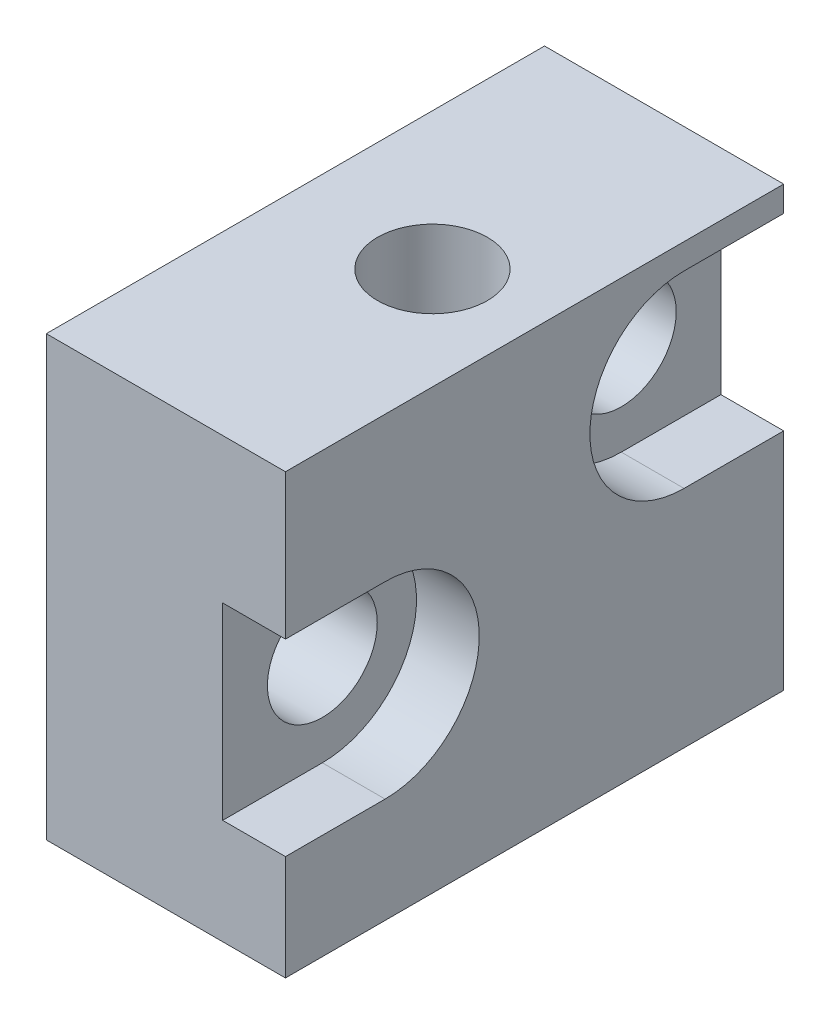
ISO-10303-21;
HEADER;
FILE_DESCRIPTION(('STEP AP214'),'2;1');
FILE_NAME('part.step','',(''),(''),'','','');
FILE_SCHEMA(('AUTOMOTIVE_DESIGN { 1 0 10303 214 1 1 1 1 }'));
ENDSEC;
DATA;
#1=APPLICATION_CONTEXT('core data for automotive mechanical design processes');
#2=APPLICATION_PROTOCOL_DEFINITION('international standard','automotive_design',2000,#1);
#3=PRODUCT_CONTEXT('',#1,'mechanical');
#4=PRODUCT('Part','Part','',(#3));
#5=PRODUCT_RELATED_PRODUCT_CATEGORY('part','',(#4));
#6=PRODUCT_DEFINITION_FORMATION('','',#4);
#7=PRODUCT_DEFINITION_CONTEXT('part definition',#1,'design');
#8=PRODUCT_DEFINITION('design','',#6,#7);
#9=PRODUCT_DEFINITION_SHAPE('','',#8);
#10=(LENGTH_UNIT() NAMED_UNIT(*) SI_UNIT(.MILLI.,.METRE.));
#11=(NAMED_UNIT(*) PLANE_ANGLE_UNIT() SI_UNIT($,.RADIAN.));
#12=(NAMED_UNIT(*) SI_UNIT($,.STERADIAN.) SOLID_ANGLE_UNIT());
#13=UNCERTAINTY_MEASURE_WITH_UNIT(LENGTH_MEASURE(1.E-05),#10,'distance_accuracy_value','');
#14=(GEOMETRIC_REPRESENTATION_CONTEXT(3) GLOBAL_UNCERTAINTY_ASSIGNED_CONTEXT((#13)) GLOBAL_UNIT_ASSIGNED_CONTEXT((#10,
#11,#12)) REPRESENTATION_CONTEXT('',''));
#15=CARTESIAN_POINT('',(0.,0.,0.));
#16=DIRECTION('',(0.,0.,1.));
#17=DIRECTION('',(1.,0.,0.));
#18=AXIS2_PLACEMENT_3D('',#15,#16,#17);
#19=CARTESIAN_POINT('',(7.62,5.715,-7.9375));
#20=DIRECTION('',(0.,0.,1.));
#21=DIRECTION('',(1.,0.,0.));
#22=AXIS2_PLACEMENT_3D('',#19,#20,#21);
#23=PLANE('',#22);
#24=DIRECTION('',(1.,0.,0.));
#25=VECTOR('',#24,1.);
#26=CARTESIAN_POINT('',(5.62,4.905,-7.9375));
#27=LINE('',#26,#25);
#28=CARTESIAN_POINT('',(5.62,4.905,-7.9375));
#29=VERTEX_POINT('',#28);
#30=CARTESIAN_POINT('',(7.62,4.905,-7.9375));
#31=VERTEX_POINT('',#30);
#32=EDGE_CURVE('E218',#29,#31,#27,.T.);
#33=ORIENTED_EDGE('',*,*,#32,.F.);
#34=DIRECTION('',(0.,1.,0.));
#35=VECTOR('',#34,1.);
#36=CARTESIAN_POINT('',(5.62,0.,-7.9375));
#37=LINE('',#36,#35);
#38=CARTESIAN_POINT('',(5.62,-1.095,-7.9375));
#39=VERTEX_POINT('',#38);
#40=EDGE_CURVE('E205',#39,#29,#37,.T.);
#41=ORIENTED_EDGE('',*,*,#40,.F.);
#42=DIRECTION('',(1.,0.,0.));
#43=VECTOR('',#42,1.);
#44=CARTESIAN_POINT('',(5.62,-1.095,-7.9375));
#45=LINE('',#44,#43);
#46=CARTESIAN_POINT('',(7.62,-1.095,-7.9375));
#47=VERTEX_POINT('',#46);
#48=EDGE_CURVE('E220',#39,#47,#45,.T.);
#49=ORIENTED_EDGE('',*,*,#48,.T.);
#50=DIRECTION('',(0.,1.,0.));
#51=VECTOR('',#50,1.);
#52=CARTESIAN_POINT('',(7.62,5.715,-7.9375));
#53=LINE('',#52,#51);
#54=CARTESIAN_POINT('',(7.62,-8.255,-7.9375));
#55=VERTEX_POINT('',#54);
#56=EDGE_CURVE('E224',#55,#47,#53,.T.);
#57=ORIENTED_EDGE('',*,*,#56,.F.);
#58=DIRECTION('',(1.,0.,0.));
#59=VECTOR('',#58,1.);
#60=CARTESIAN_POINT('',(0.,-8.255,-7.9375));
#61=LINE('',#60,#59);
#62=CARTESIAN_POINT('',(0.,-8.255,-7.9375));
#63=VERTEX_POINT('',#62);
#64=EDGE_CURVE('E156',#63,#55,#61,.T.);
#65=ORIENTED_EDGE('',*,*,#64,.F.);
#66=DIRECTION('',(0.,1.,0.));
#67=VECTOR('',#66,1.);
#68=CARTESIAN_POINT('',(0.,5.715,-7.9375));
#69=LINE('',#68,#67);
#70=CARTESIAN_POINT('',(0.,5.715,-7.9375));
#71=VERTEX_POINT('',#70);
#72=EDGE_CURVE('E159',#63,#71,#69,.T.);
#73=ORIENTED_EDGE('',*,*,#72,.T.);
#74=DIRECTION('',(-1.,0.,0.));
#75=VECTOR('',#74,1.);
#76=CARTESIAN_POINT('',(7.62,5.715,-7.9375));
#77=LINE('',#76,#75);
#78=CARTESIAN_POINT('',(7.62,5.715,-7.9375));
#79=VERTEX_POINT('',#78);
#80=EDGE_CURVE('E11',#79,#71,#77,.T.);
#81=ORIENTED_EDGE('',*,*,#80,.F.);
#82=EDGE_CURVE('E146',#31,#79,#53,.T.);
#83=ORIENTED_EDGE('',*,*,#82,.F.);
#84=EDGE_LOOP('',(#33,#41,#49,#57,#65,#73,#81,#83));
#85=FACE_BOUND('',#84,.T.);
#86=ADVANCED_FACE('F41',(#85),#23,.F.);
#87=CARTESIAN_POINT('',(7.62,5.715,7.9375));
#88=DIRECTION('',(0.,0.,-1.));
#89=DIRECTION('',(-1.,0.,0.));
#90=AXIS2_PLACEMENT_3D('',#87,#88,#89);
#91=PLANE('',#90);
#92=DIRECTION('',(1.,0.,0.));
#93=VECTOR('',#92,1.);
#94=CARTESIAN_POINT('',(5.62,-4.905,7.9375));
#95=LINE('',#94,#93);
#96=CARTESIAN_POINT('',(5.62,-4.905,7.9375));
#97=VERTEX_POINT('',#96);
#98=CARTESIAN_POINT('',(7.62,-4.905,7.9375));
#99=VERTEX_POINT('',#98);
#100=EDGE_CURVE('E190',#97,#99,#95,.T.);
#101=ORIENTED_EDGE('',*,*,#100,.F.);
#102=DIRECTION('',(0.,-1.,0.));
#103=VECTOR('',#102,1.);
#104=CARTESIAN_POINT('',(5.62,0.,7.9375));
#105=LINE('',#104,#103);
#106=CARTESIAN_POINT('',(5.62,1.095,7.9375));
#107=VERTEX_POINT('',#106);
#108=EDGE_CURVE('E174',#107,#97,#105,.T.);
#109=ORIENTED_EDGE('',*,*,#108,.F.);
#110=DIRECTION('',(1.,0.,0.));
#111=VECTOR('',#110,1.);
#112=CARTESIAN_POINT('',(5.62,1.095,7.9375));
#113=LINE('',#112,#111);
#114=CARTESIAN_POINT('',(7.62,1.095,7.9375));
#115=VERTEX_POINT('',#114);
#116=EDGE_CURVE('E192',#107,#115,#113,.T.);
#117=ORIENTED_EDGE('',*,*,#116,.T.);
#118=DIRECTION('',(0.,-1.,0.));
#119=VECTOR('',#118,1.);
#120=CARTESIAN_POINT('',(7.62,5.715,7.9375));
#121=LINE('',#120,#119);
#122=CARTESIAN_POINT('',(7.62,5.715,7.9375));
#123=VERTEX_POINT('',#122);
#124=EDGE_CURVE('E230',#123,#115,#121,.T.);
#125=ORIENTED_EDGE('',*,*,#124,.F.);
#126=DIRECTION('',(-1.,0.,0.));
#127=VECTOR('',#126,1.);
#128=CARTESIAN_POINT('',(7.62,5.715,7.9375));
#129=LINE('',#128,#127);
#130=CARTESIAN_POINT('',(0.,5.715,7.9375));
#131=VERTEX_POINT('',#130);
#132=EDGE_CURVE('E49',#123,#131,#129,.T.);
#133=ORIENTED_EDGE('',*,*,#132,.T.);
#134=DIRECTION('',(0.,-1.,0.));
#135=VECTOR('',#134,1.);
#136=CARTESIAN_POINT('',(0.,5.715,7.9375));
#137=LINE('',#136,#135);
#138=CARTESIAN_POINT('',(0.,-8.255,7.9375));
#139=VERTEX_POINT('',#138);
#140=EDGE_CURVE('E134',#131,#139,#137,.T.);
#141=ORIENTED_EDGE('',*,*,#140,.T.);
#142=DIRECTION('',(1.,0.,0.));
#143=VECTOR('',#142,1.);
#144=CARTESIAN_POINT('',(0.,-8.255,7.9375));
#145=LINE('',#144,#143);
#146=CARTESIAN_POINT('',(7.62,-8.255,7.9375));
#147=VERTEX_POINT('',#146);
#148=EDGE_CURVE('E139',#139,#147,#145,.T.);
#149=ORIENTED_EDGE('',*,*,#148,.T.);
#150=EDGE_CURVE('E229',#99,#147,#121,.T.);
#151=ORIENTED_EDGE('',*,*,#150,.F.);
#152=EDGE_LOOP('',(#101,#109,#117,#125,#133,#141,#149,#151));
#153=FACE_BOUND('',#152,.T.);
#154=ADVANCED_FACE('F137',(#153),#91,.F.);
#155=CARTESIAN_POINT('',(7.62,0.,0.));
#156=DIRECTION('',(1.,0.,0.));
#157=DIRECTION('',(0.,0.,-1.));
#158=AXIS2_PLACEMENT_3D('',#155,#156,#157);
#159=PLANE('',#158);
#160=CARTESIAN_POINT('',(7.62,-1.905,4.7625));
#161=DIRECTION('',(1.,0.,0.));
#162=DIRECTION('',(0.,0.,-1.));
#163=AXIS2_PLACEMENT_3D('',#160,#161,#162);
#164=CIRCLE('',#163,3.);
#165=CARTESIAN_POINT('',(7.62,-4.905,4.7625));
#166=VERTEX_POINT('',#165);
#167=CARTESIAN_POINT('',(7.62,1.095,4.7625));
#168=VERTEX_POINT('',#167);
#169=EDGE_CURVE('E57',#166,#168,#164,.T.);
#170=ORIENTED_EDGE('',*,*,#169,.F.);
#171=DIRECTION('',(0.,0.,1.));
#172=VECTOR('',#171,1.);
#173=CARTESIAN_POINT('',(7.62,-4.905,0.));
#174=LINE('',#173,#172);
#175=EDGE_CURVE('E169',#166,#99,#174,.T.);
#176=ORIENTED_EDGE('',*,*,#175,.T.);
#177=ORIENTED_EDGE('',*,*,#150,.T.);
#178=DIRECTION('',(0.,0.,-1.));
#179=VECTOR('',#178,1.);
#180=CARTESIAN_POINT('',(7.62,-8.255,7.9375));
#181=LINE('',#180,#179);
#182=EDGE_CURVE('E155',#147,#55,#181,.T.);
#183=ORIENTED_EDGE('',*,*,#182,.T.);
#184=ORIENTED_EDGE('',*,*,#56,.T.);
#185=DIRECTION('',(0.,0.,1.));
#186=VECTOR('',#185,1.);
#187=CARTESIAN_POINT('',(7.62,-1.095,0.));
#188=LINE('',#187,#186);
#189=CARTESIAN_POINT('',(7.62,-1.095,-4.7625));
#190=VERTEX_POINT('',#189);
#191=EDGE_CURVE('E212',#47,#190,#188,.T.);
#192=ORIENTED_EDGE('',*,*,#191,.T.);
#193=CARTESIAN_POINT('',(7.62,1.905,-4.7625));
#194=DIRECTION('',(1.,0.,0.));
#195=DIRECTION('',(0.,0.,-1.));
#196=AXIS2_PLACEMENT_3D('',#193,#194,#195);
#197=CIRCLE('',#196,3.);
#198=CARTESIAN_POINT('',(7.62,4.905,-4.7625));
#199=VERTEX_POINT('',#198);
#200=EDGE_CURVE('E65',#199,#190,#197,.T.);
#201=ORIENTED_EDGE('',*,*,#200,.F.);
#202=DIRECTION('',(0.,0.,-1.));
#203=VECTOR('',#202,1.);
#204=CARTESIAN_POINT('',(7.62,4.905,0.));
#205=LINE('',#204,#203);
#206=EDGE_CURVE('E200',#199,#31,#205,.T.);
#207=ORIENTED_EDGE('',*,*,#206,.T.);
#208=ORIENTED_EDGE('',*,*,#82,.T.);
#209=DIRECTION('',(0.,0.,1.));
#210=VECTOR('',#209,1.);
#211=CARTESIAN_POINT('',(7.62,5.715,-7.9375));
#212=LINE('',#211,#210);
#213=EDGE_CURVE('E227',#79,#123,#212,.T.);
#214=ORIENTED_EDGE('',*,*,#213,.T.);
#215=ORIENTED_EDGE('',*,*,#124,.T.);
#216=DIRECTION('',(0.,0.,-1.));
#217=VECTOR('',#216,1.);
#218=CARTESIAN_POINT('',(7.62,1.095,0.));
#219=LINE('',#218,#217);
#220=EDGE_CURVE('E181',#115,#168,#219,.T.);
#221=ORIENTED_EDGE('',*,*,#220,.T.);
#222=EDGE_LOOP('',(#170,#176,#177,#183,#184,#192,#201,#207,#208,#214,#215,#221));
#223=FACE_BOUND('',#222,.T.);
#224=ADVANCED_FACE('F268',(#223),#159,.T.);
#225=CARTESIAN_POINT('',(-14.6685,1.905,-4.7625));
#226=DIRECTION('',(1.,0.,0.));
#227=DIRECTION('',(0.,0.,-1.));
#228=AXIS2_PLACEMENT_3D('',#225,#226,#227);
#229=CYLINDRICAL_SURFACE('',#228,1.75);
#230=CARTESIAN_POINT('',(0.,1.905,-4.7625));
#231=DIRECTION('',(1.,0.,0.));
#232=DIRECTION('',(0.,0.,-1.));
#233=AXIS2_PLACEMENT_3D('',#230,#231,#232);
#234=CIRCLE('',#233,1.75);
#235=CARTESIAN_POINT('',(0.,1.905,-6.5125));
#236=VERTEX_POINT('',#235);
#237=EDGE_CURVE('E189',#236,#236,#234,.T.);
#238=ORIENTED_EDGE('',*,*,#237,.F.);
#239=EDGE_LOOP('',(#238));
#240=FACE_BOUND('',#239,.T.);
#241=CARTESIAN_POINT('',(5.62,1.905,-4.7625));
#242=DIRECTION('',(1.,0.,0.));
#243=DIRECTION('',(0.,0.,-1.));
#244=AXIS2_PLACEMENT_3D('',#241,#242,#243);
#245=CIRCLE('',#244,1.75);
#246=CARTESIAN_POINT('',(5.62,1.905,-6.5125));
#247=VERTEX_POINT('',#246);
#248=EDGE_CURVE('E196',#247,#247,#245,.F.);
#249=ORIENTED_EDGE('',*,*,#248,.F.);
#250=EDGE_LOOP('',(#249));
#251=FACE_BOUND('',#250,.T.);
#252=ADVANCED_FACE('F250',(#240,#251),#229,.F.);
#253=CARTESIAN_POINT('',(-14.6685,-1.905,4.7625));
#254=DIRECTION('',(1.,0.,0.));
#255=DIRECTION('',(0.,0.,-1.));
#256=AXIS2_PLACEMENT_3D('',#253,#254,#255);
#257=CYLINDRICAL_SURFACE('',#256,1.75);
#258=CARTESIAN_POINT('',(0.,-1.905,4.7625));
#259=DIRECTION('',(1.,0.,0.));
#260=DIRECTION('',(0.,0.,-1.));
#261=AXIS2_PLACEMENT_3D('',#258,#259,#260);
#262=CIRCLE('',#261,1.75);
#263=CARTESIAN_POINT('',(0.,-1.905,3.0125));
#264=VERTEX_POINT('',#263);
#265=EDGE_CURVE('E239',#264,#264,#262,.T.);
#266=ORIENTED_EDGE('',*,*,#265,.F.);
#267=EDGE_LOOP('',(#266));
#268=FACE_BOUND('',#267,.T.);
#269=CARTESIAN_POINT('',(5.62,-1.905,4.7625));
#270=DIRECTION('',(1.,0.,0.));
#271=DIRECTION('',(0.,0.,-1.));
#272=AXIS2_PLACEMENT_3D('',#269,#270,#271);
#273=CIRCLE('',#272,1.75);
#274=CARTESIAN_POINT('',(5.62,-1.905,3.0125));
#275=VERTEX_POINT('',#274);
#276=EDGE_CURVE('E165',#275,#275,#273,.F.);
#277=ORIENTED_EDGE('',*,*,#276,.F.);
#278=EDGE_LOOP('',(#277));
#279=FACE_BOUND('',#278,.T.);
#280=ADVANCED_FACE('F246',(#268,#279),#257,.F.);
#281=CARTESIAN_POINT('',(7.62,5.715,-7.9375));
#282=DIRECTION('',(0.,-1.,0.));
#283=DIRECTION('',(0.,0.,-1.));
#284=AXIS2_PLACEMENT_3D('',#281,#282,#283);
#285=PLANE('',#284);
#286=CARTESIAN_POINT('',(4.36625,5.715,0.));
#287=DIRECTION('',(0.,-1.,0.));
#288=DIRECTION('',(0.,0.,-1.));
#289=AXIS2_PLACEMENT_3D('',#286,#287,#288);
#290=CIRCLE('',#289,1.75);
#291=CARTESIAN_POINT('',(4.36625,5.715,-1.75));
#292=VERTEX_POINT('',#291);
#293=EDGE_CURVE('E234',#292,#292,#290,.T.);
#294=ORIENTED_EDGE('',*,*,#293,.T.);
#295=EDGE_LOOP('',(#294));
#296=FACE_BOUND('',#295,.T.);
#297=DIRECTION('',(0.,0.,1.));
#298=VECTOR('',#297,1.);
#299=CARTESIAN_POINT('',(0.,5.715,-7.9375));
#300=LINE('',#299,#298);
#301=EDGE_CURVE('E147',#71,#131,#300,.T.);
#302=ORIENTED_EDGE('',*,*,#301,.T.);
#303=ORIENTED_EDGE('',*,*,#132,.F.);
#304=ORIENTED_EDGE('',*,*,#213,.F.);
#305=ORIENTED_EDGE('',*,*,#80,.T.);
#306=EDGE_LOOP('',(#302,#303,#304,#305));
#307=FACE_BOUND('',#306,.T.);
#308=ADVANCED_FACE('F249',(#296,#307),#285,.F.);
#309=CARTESIAN_POINT('',(0.,0.,0.));
#310=DIRECTION('',(1.,0.,0.));
#311=DIRECTION('',(0.,0.,-1.));
#312=AXIS2_PLACEMENT_3D('',#309,#310,#311);
#313=PLANE('',#312);
#314=ORIENTED_EDGE('',*,*,#265,.T.);
#315=EDGE_LOOP('',(#314));
#316=FACE_BOUND('',#315,.T.);
#317=ORIENTED_EDGE('',*,*,#237,.T.);
#318=EDGE_LOOP('',(#317));
#319=FACE_BOUND('',#318,.T.);
#320=ORIENTED_EDGE('',*,*,#72,.F.);
#321=DIRECTION('',(0.,0.,-1.));
#322=VECTOR('',#321,1.);
#323=CARTESIAN_POINT('',(0.,-8.255,7.9375));
#324=LINE('',#323,#322);
#325=EDGE_CURVE('E153',#139,#63,#324,.T.);
#326=ORIENTED_EDGE('',*,*,#325,.F.);
#327=ORIENTED_EDGE('',*,*,#140,.F.);
#328=ORIENTED_EDGE('',*,*,#301,.F.);
#329=EDGE_LOOP('',(#320,#326,#327,#328));
#330=FACE_BOUND('',#329,.T.);
#331=ADVANCED_FACE('F158',(#316,#319,#330),#313,.F.);
#332=CARTESIAN_POINT('',(4.36625,16.5735,0.));
#333=DIRECTION('',(0.,-1.,0.));
#334=DIRECTION('',(0.,0.,-1.));
#335=AXIS2_PLACEMENT_3D('',#332,#333,#334);
#336=CYLINDRICAL_SURFACE('',#335,1.75);
#337=CARTESIAN_POINT('',(4.36625,-8.255,0.));
#338=DIRECTION('',(0.,-1.,0.));
#339=DIRECTION('',(0.,0.,-1.));
#340=AXIS2_PLACEMENT_3D('',#337,#338,#339);
#341=CIRCLE('',#340,1.75);
#342=CARTESIAN_POINT('',(4.36625,-8.255,-1.75));
#343=VERTEX_POINT('',#342);
#344=EDGE_CURVE('E44',#343,#343,#341,.T.);
#345=CARTESIAN_POINT('',(4.36625,5.715,-1.75));
#346=CARTESIAN_POINT('',(4.36625,5.56947916666667,-1.75));
#347=CARTESIAN_POINT('',(4.36625,5.42395833333333,-1.75));
#348=CARTESIAN_POINT('',(4.36625,5.13291666666667,-1.75));
#349=CARTESIAN_POINT('',(4.36625,4.98739583333333,-1.75));
#350=CARTESIAN_POINT('',(4.36625,4.69635416666667,-1.75));
#351=CARTESIAN_POINT('',(4.36625,4.55083333333334,-1.75));
#352=CARTESIAN_POINT('',(4.36625,4.25979166666667,-1.75));
#353=CARTESIAN_POINT('',(4.36625,4.11427083333334,-1.75));
#354=CARTESIAN_POINT('',(4.36625,3.82322916666667,-1.75));
#355=CARTESIAN_POINT('',(4.36625,3.67770833333334,-1.75));
#356=CARTESIAN_POINT('',(4.36625,3.38666666666667,-1.75));
#357=CARTESIAN_POINT('',(4.36625,3.24114583333334,-1.75));
#358=CARTESIAN_POINT('',(4.36625,2.95010416666667,-1.75));
#359=CARTESIAN_POINT('',(4.36625,2.80458333333333,-1.75));
#360=CARTESIAN_POINT('',(4.36625,2.51354166666667,-1.75));
#361=CARTESIAN_POINT('',(4.36625,2.36802083333334,-1.75));
#362=CARTESIAN_POINT('',(4.36625,2.07697916666667,-1.75));
#363=CARTESIAN_POINT('',(4.36625,1.93145833333333,-1.75));
#364=CARTESIAN_POINT('',(4.36625,1.64041666666667,-1.75));
#365=CARTESIAN_POINT('',(4.36625,1.49489583333333,-1.75));
#366=CARTESIAN_POINT('',(4.36625,1.20385416666667,-1.75));
#367=CARTESIAN_POINT('',(4.36625,1.05833333333334,-1.75));
#368=CARTESIAN_POINT('',(4.36625,0.767291666666668,-1.75));
#369=CARTESIAN_POINT('',(4.36625,0.621770833333335,-1.75));
#370=CARTESIAN_POINT('',(4.36625,0.330729166666668,-1.75));
#371=CARTESIAN_POINT('',(4.36625,0.185208333333336,-1.75));
#372=CARTESIAN_POINT('',(4.36625,-0.10583333333333,-1.75));
#373=CARTESIAN_POINT('',(4.36625,-0.251354166666664,-1.75));
#374=CARTESIAN_POINT('',(4.36625,-0.542395833333332,-1.75));
#375=CARTESIAN_POINT('',(4.36625,-0.687916666666665,-1.75));
#376=CARTESIAN_POINT('',(4.36625,-0.978958333333333,-1.75));
#377=CARTESIAN_POINT('',(4.36625,-1.12447916666667,-1.75));
#378=CARTESIAN_POINT('',(4.36625,-1.41552083333333,-1.75));
#379=CARTESIAN_POINT('',(4.36625,-1.56104166666667,-1.75));
#380=CARTESIAN_POINT('',(4.36625,-1.85208333333333,-1.75));
#381=CARTESIAN_POINT('',(4.36625,-1.99760416666667,-1.75));
#382=CARTESIAN_POINT('',(4.36625,-2.28864583333333,-1.75));
#383=CARTESIAN_POINT('',(4.36625,-2.43416666666666,-1.75));
#384=CARTESIAN_POINT('',(4.36625,-2.72520833333333,-1.75));
#385=CARTESIAN_POINT('',(4.36625,-2.87072916666666,-1.75));
#386=CARTESIAN_POINT('',(4.36625,-3.16177083333333,-1.75));
#387=CARTESIAN_POINT('',(4.36625,-3.30729166666667,-1.75));
#388=CARTESIAN_POINT('',(4.36625,-3.59833333333333,-1.75));
#389=CARTESIAN_POINT('',(4.36625,-3.74385416666667,-1.75));
#390=CARTESIAN_POINT('',(4.36625,-4.03489583333333,-1.75));
#391=CARTESIAN_POINT('',(4.36625,-4.18041666666667,-1.75));
#392=CARTESIAN_POINT('',(4.36625,-4.47145833333333,-1.75));
#393=CARTESIAN_POINT('',(4.36625,-4.61697916666667,-1.75));
#394=CARTESIAN_POINT('',(4.36625,-4.90802083333333,-1.75));
#395=CARTESIAN_POINT('',(4.36625,-5.05354166666666,-1.75));
#396=CARTESIAN_POINT('',(4.36625,-5.34458333333333,-1.75));
#397=CARTESIAN_POINT('',(4.36625,-5.49010416666667,-1.75));
#398=CARTESIAN_POINT('',(4.36625,-5.78114583333333,-1.75));
#399=CARTESIAN_POINT('',(4.36625,-5.92666666666667,-1.75));
#400=CARTESIAN_POINT('',(4.36625,-6.21770833333333,-1.75));
#401=CARTESIAN_POINT('',(4.36625,-6.36322916666667,-1.75));
#402=CARTESIAN_POINT('',(4.36625,-6.65427083333333,-1.75));
#403=CARTESIAN_POINT('',(4.36625,-6.79979166666667,-1.75));
#404=CARTESIAN_POINT('',(4.36625,-7.09083333333333,-1.75));
#405=CARTESIAN_POINT('',(4.36625,-7.23635416666666,-1.75));
#406=CARTESIAN_POINT('',(4.36625,-7.52739583333333,-1.75));
#407=CARTESIAN_POINT('',(4.36625,-7.67291666666666,-1.75));
#408=CARTESIAN_POINT('',(4.36625,-7.96395833333333,-1.75));
#409=CARTESIAN_POINT('',(4.36625,-8.10947916666666,-1.75));
#410=CARTESIAN_POINT('',(4.36625,-8.255,-1.75));
#411=B_SPLINE_CURVE_WITH_KNOTS('',3,(#345,#346,#347,#348,#349,#350,#351,#352,#353,#354,#355,
#356,#357,#358,#359,#360,#361,#362,#363,#364,#365,#366,#367,#368,#369,#370,#371,#372,#373,#374,
#375,#376,#377,#378,#379,#380,#381,#382,#383,#384,#385,#386,#387,#388,#389,#390,#391,#392,#393,
#394,#395,#396,#397,#398,#399,#400,#401,#402,#403,#404,#405,#406,#407,#408,#409,#410),
.UNSPECIFIED.,.F.,.F.,(4,2,2,2,2,2,2,2,2,2,2,2,2,2,2,2,2,2,2,2,2,2,2,2,2,2,2,2,2,2,2,2,4),(0.,
0.436562499999999,0.873125000000001,1.3096875,1.74625,2.1828125,2.619375,3.0559375,3.4925,
3.9290625,4.365625,4.8021875,5.23875,5.6753125,6.111875,6.5484375,6.985,7.4215625,7.858125,
8.2946875,8.73125,9.1678125,9.604375,10.0409375,10.4775,10.9140625,11.350625,11.7871875,
12.22375,12.6603125,13.096875,13.5334375,13.97),.UNSPECIFIED.);
#412=EDGE_CURVE('BSEAM294',#292,#343,#411,.T.);
#413=ORIENTED_EDGE('',*,*,#293,.F.);
#414=ORIENTED_EDGE('',*,*,#344,.T.);
#415=ORIENTED_EDGE('',*,*,#412,.T.);
#416=ORIENTED_EDGE('',*,*,#412,.F.);
#417=EDGE_LOOP('',(#413,#415,#414,#416));
#418=FACE_BOUND('',#417,.T.);
#419=ADVANCED_FACE('F294',(#418),#336,.F.);
#420=CARTESIAN_POINT('',(5.62,-1.905,4.7625));
#421=DIRECTION('',(1.,0.,0.));
#422=DIRECTION('',(0.,0.,-1.));
#423=AXIS2_PLACEMENT_3D('',#420,#421,#422);
#424=CYLINDRICAL_SURFACE('',#423,3.);
#425=ORIENTED_EDGE('',*,*,#169,.T.);
#426=DIRECTION('',(1.,0.,0.));
#427=VECTOR('',#426,1.);
#428=CARTESIAN_POINT('',(5.62,1.095,4.7625));
#429=LINE('',#428,#427);
#430=CARTESIAN_POINT('',(5.62,1.095,4.7625));
#431=VERTEX_POINT('',#430);
#432=EDGE_CURVE('E179',#431,#168,#429,.T.);
#433=ORIENTED_EDGE('',*,*,#432,.F.);
#434=CARTESIAN_POINT('',(5.62,-1.905,4.7625));
#435=DIRECTION('',(1.,0.,0.));
#436=DIRECTION('',(0.,0.,-1.));
#437=AXIS2_PLACEMENT_3D('',#434,#435,#436);
#438=CIRCLE('',#437,3.);
#439=CARTESIAN_POINT('',(5.62,-4.905,4.7625));
#440=VERTEX_POINT('',#439);
#441=EDGE_CURVE('E168',#440,#431,#438,.T.);
#442=ORIENTED_EDGE('',*,*,#441,.F.);
#443=DIRECTION('',(1.,0.,0.));
#444=VECTOR('',#443,1.);
#445=CARTESIAN_POINT('',(5.62,-4.905,4.7625));
#446=LINE('',#445,#444);
#447=EDGE_CURVE('E187',#440,#166,#446,.T.);
#448=ORIENTED_EDGE('',*,*,#447,.T.);
#449=EDGE_LOOP('',(#425,#433,#442,#448));
#450=FACE_BOUND('',#449,.T.);
#451=ADVANCED_FACE('F264',(#450),#424,.F.);
#452=CARTESIAN_POINT('',(5.62,-4.905,0.));
#453=DIRECTION('',(0.,1.,0.));
#454=DIRECTION('',(0.,0.,1.));
#455=AXIS2_PLACEMENT_3D('',#452,#453,#454);
#456=PLANE('',#455);
#457=ORIENTED_EDGE('',*,*,#175,.F.);
#458=ORIENTED_EDGE('',*,*,#447,.F.);
#459=DIRECTION('',(0.,0.,1.));
#460=VECTOR('',#459,1.);
#461=CARTESIAN_POINT('',(5.62,-4.905,0.));
#462=LINE('',#461,#460);
#463=EDGE_CURVE('E177',#440,#97,#462,.T.);
#464=ORIENTED_EDGE('',*,*,#463,.T.);
#465=ORIENTED_EDGE('',*,*,#100,.T.);
#466=EDGE_LOOP('',(#457,#458,#464,#465));
#467=FACE_BOUND('',#466,.T.);
#468=ADVANCED_FACE('F271',(#467),#456,.T.);
#469=CARTESIAN_POINT('',(5.62,1.095,0.));
#470=DIRECTION('',(0.,-1.,0.));
#471=DIRECTION('',(0.,0.,-1.));
#472=AXIS2_PLACEMENT_3D('',#469,#470,#471);
#473=PLANE('',#472);
#474=ORIENTED_EDGE('',*,*,#220,.F.);
#475=ORIENTED_EDGE('',*,*,#116,.F.);
#476=DIRECTION('',(0.,0.,-1.));
#477=VECTOR('',#476,1.);
#478=CARTESIAN_POINT('',(5.62,1.095,0.));
#479=LINE('',#478,#477);
#480=EDGE_CURVE('E172',#107,#431,#479,.T.);
#481=ORIENTED_EDGE('',*,*,#480,.T.);
#482=ORIENTED_EDGE('',*,*,#432,.T.);
#483=EDGE_LOOP('',(#474,#475,#481,#482));
#484=FACE_BOUND('',#483,.T.);
#485=ADVANCED_FACE('F258',(#484),#473,.T.);
#486=CARTESIAN_POINT('',(5.62,0.,0.));
#487=DIRECTION('',(1.,0.,0.));
#488=DIRECTION('',(0.,0.,-1.));
#489=AXIS2_PLACEMENT_3D('',#486,#487,#488);
#490=PLANE('',#489);
#491=ORIENTED_EDGE('',*,*,#276,.T.);
#492=EDGE_LOOP('',(#491));
#493=FACE_BOUND('',#492,.T.);
#494=ORIENTED_EDGE('',*,*,#441,.T.);
#495=ORIENTED_EDGE('',*,*,#480,.F.);
#496=ORIENTED_EDGE('',*,*,#108,.T.);
#497=ORIENTED_EDGE('',*,*,#463,.F.);
#498=EDGE_LOOP('',(#494,#495,#496,#497));
#499=FACE_BOUND('',#498,.T.);
#500=ADVANCED_FACE('F254',(#493,#499),#490,.T.);
#501=CARTESIAN_POINT('',(5.62,1.905,-4.7625));
#502=DIRECTION('',(1.,0.,0.));
#503=DIRECTION('',(0.,0.,-1.));
#504=AXIS2_PLACEMENT_3D('',#501,#502,#503);
#505=CYLINDRICAL_SURFACE('',#504,3.);
#506=ORIENTED_EDGE('',*,*,#200,.T.);
#507=DIRECTION('',(1.,0.,0.));
#508=VECTOR('',#507,1.);
#509=CARTESIAN_POINT('',(5.62,-1.095,-4.7625));
#510=LINE('',#509,#508);
#511=CARTESIAN_POINT('',(5.62,-1.095,-4.7625));
#512=VERTEX_POINT('',#511);
#513=EDGE_CURVE('E210',#512,#190,#510,.T.);
#514=ORIENTED_EDGE('',*,*,#513,.F.);
#515=CARTESIAN_POINT('',(5.62,1.905,-4.7625));
#516=DIRECTION('',(1.,0.,0.));
#517=DIRECTION('',(0.,0.,-1.));
#518=AXIS2_PLACEMENT_3D('',#515,#516,#517);
#519=CIRCLE('',#518,3.);
#520=CARTESIAN_POINT('',(5.62,4.905,-4.7625));
#521=VERTEX_POINT('',#520);
#522=EDGE_CURVE('E199',#521,#512,#519,.T.);
#523=ORIENTED_EDGE('',*,*,#522,.F.);
#524=DIRECTION('',(1.,0.,0.));
#525=VECTOR('',#524,1.);
#526=CARTESIAN_POINT('',(5.62,4.905,-4.7625));
#527=LINE('',#526,#525);
#528=EDGE_CURVE('E182',#521,#199,#527,.T.);
#529=ORIENTED_EDGE('',*,*,#528,.T.);
#530=EDGE_LOOP('',(#506,#514,#523,#529));
#531=FACE_BOUND('',#530,.T.);
#532=ADVANCED_FACE('F257',(#531),#505,.F.);
#533=CARTESIAN_POINT('',(5.62,4.905,0.));
#534=DIRECTION('',(0.,-1.,0.));
#535=DIRECTION('',(0.,0.,-1.));
#536=AXIS2_PLACEMENT_3D('',#533,#534,#535);
#537=PLANE('',#536);
#538=ORIENTED_EDGE('',*,*,#206,.F.);
#539=ORIENTED_EDGE('',*,*,#528,.F.);
#540=DIRECTION('',(0.,0.,-1.));
#541=VECTOR('',#540,1.);
#542=CARTESIAN_POINT('',(5.62,4.905,0.));
#543=LINE('',#542,#541);
#544=EDGE_CURVE('E208',#521,#29,#543,.T.);
#545=ORIENTED_EDGE('',*,*,#544,.T.);
#546=ORIENTED_EDGE('',*,*,#32,.T.);
#547=EDGE_LOOP('',(#538,#539,#545,#546));
#548=FACE_BOUND('',#547,.T.);
#549=ADVANCED_FACE('F284',(#548),#537,.T.);
#550=CARTESIAN_POINT('',(5.62,-1.095,0.));
#551=DIRECTION('',(0.,1.,0.));
#552=DIRECTION('',(0.,0.,1.));
#553=AXIS2_PLACEMENT_3D('',#550,#551,#552);
#554=PLANE('',#553);
#555=ORIENTED_EDGE('',*,*,#191,.F.);
#556=ORIENTED_EDGE('',*,*,#48,.F.);
#557=DIRECTION('',(0.,0.,1.));
#558=VECTOR('',#557,1.);
#559=CARTESIAN_POINT('',(5.62,-1.095,0.));
#560=LINE('',#559,#558);
#561=EDGE_CURVE('E203',#39,#512,#560,.T.);
#562=ORIENTED_EDGE('',*,*,#561,.T.);
#563=ORIENTED_EDGE('',*,*,#513,.T.);
#564=EDGE_LOOP('',(#555,#556,#562,#563));
#565=FACE_BOUND('',#564,.T.);
#566=ADVANCED_FACE('F277',(#565),#554,.T.);
#567=CARTESIAN_POINT('',(5.62,0.,0.));
#568=DIRECTION('',(1.,0.,0.));
#569=DIRECTION('',(0.,0.,-1.));
#570=AXIS2_PLACEMENT_3D('',#567,#568,#569);
#571=PLANE('',#570);
#572=ORIENTED_EDGE('',*,*,#248,.T.);
#573=EDGE_LOOP('',(#572));
#574=FACE_BOUND('',#573,.T.);
#575=ORIENTED_EDGE('',*,*,#522,.T.);
#576=ORIENTED_EDGE('',*,*,#561,.F.);
#577=ORIENTED_EDGE('',*,*,#40,.T.);
#578=ORIENTED_EDGE('',*,*,#544,.F.);
#579=EDGE_LOOP('',(#575,#576,#577,#578));
#580=FACE_BOUND('',#579,.T.);
#581=ADVANCED_FACE('F279',(#574,#580),#571,.T.);
#582=CARTESIAN_POINT('',(0.,-8.255,7.9375));
#583=DIRECTION('',(0.,-1.,0.));
#584=DIRECTION('',(0.,0.,-1.));
#585=AXIS2_PLACEMENT_3D('',#582,#583,#584);
#586=PLANE('',#585);
#587=ORIENTED_EDGE('',*,*,#344,.F.);
#588=EDGE_LOOP('',(#587));
#589=FACE_BOUND('',#588,.T.);
#590=ORIENTED_EDGE('',*,*,#182,.F.);
#591=ORIENTED_EDGE('',*,*,#148,.F.);
#592=ORIENTED_EDGE('',*,*,#325,.T.);
#593=ORIENTED_EDGE('',*,*,#64,.T.);
#594=EDGE_LOOP('',(#590,#591,#592,#593));
#595=FACE_BOUND('',#594,.T.);
#596=ADVANCED_FACE('F151',(#589,#595),#586,.T.);
#597=CLOSED_SHELL('',(#86,#154,#224,#252,#280,#308,#331,#419,#451,#468,#485,#500,#532,#549,#566,
#581,#596));
#598=MANIFOLD_SOLID_BREP('B2',#597);
#599=ADVANCED_BREP_SHAPE_REPRESENTATION('',(#18,#598),#14);
#600=SHAPE_DEFINITION_REPRESENTATION(#9,#599);
ENDSEC;
END-ISO-10303-21;
